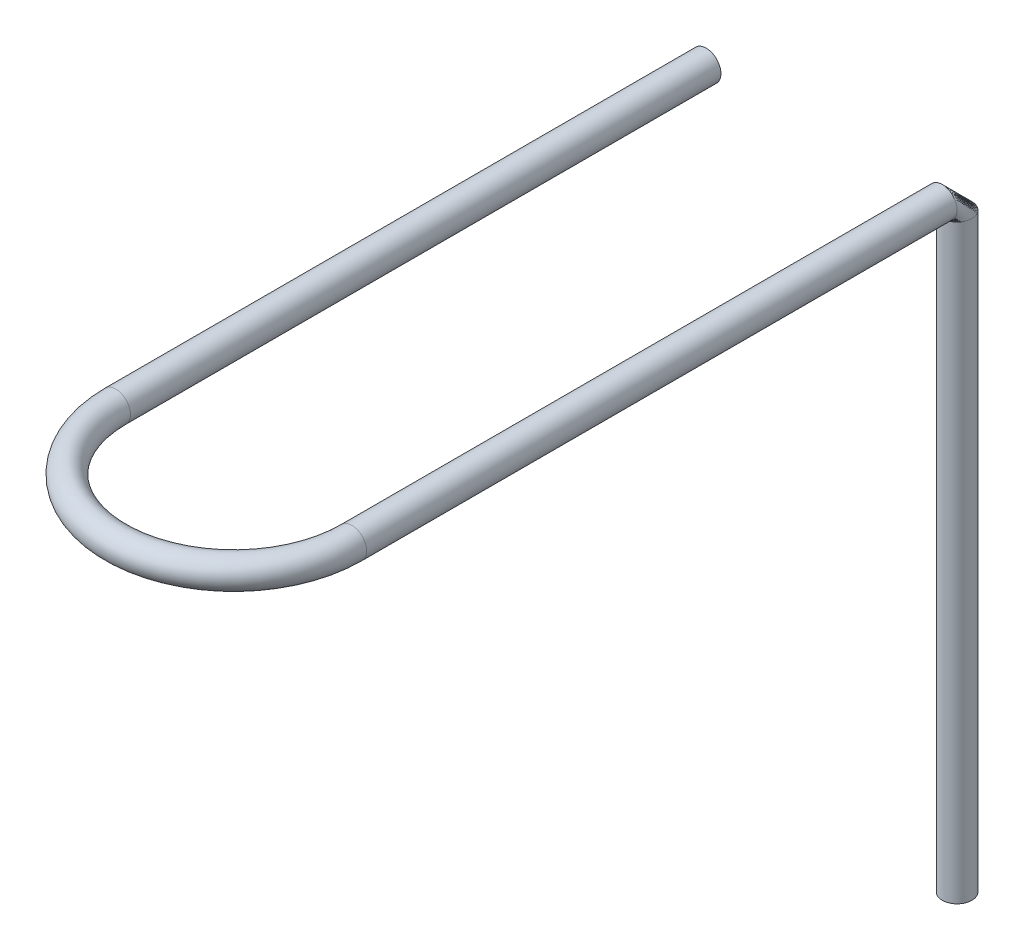
ISO-10303-21;
HEADER;
FILE_DESCRIPTION(('STEP AP214'),'2;1');
FILE_NAME('part.step','',(''),(''),'','','');
FILE_SCHEMA(('AUTOMOTIVE_DESIGN { 1 0 10303 214 1 1 1 1 }'));
ENDSEC;
DATA;
#1=APPLICATION_CONTEXT('core data for automotive mechanical design processes');
#2=APPLICATION_PROTOCOL_DEFINITION('international standard','automotive_design',2000,#1);
#3=PRODUCT_CONTEXT('',#1,'mechanical');
#4=PRODUCT('Part','Part','',(#3));
#5=PRODUCT_RELATED_PRODUCT_CATEGORY('part','',(#4));
#6=PRODUCT_DEFINITION_FORMATION('','',#4);
#7=PRODUCT_DEFINITION_CONTEXT('part definition',#1,'design');
#8=PRODUCT_DEFINITION('design','',#6,#7);
#9=PRODUCT_DEFINITION_SHAPE('','',#8);
#10=(LENGTH_UNIT() NAMED_UNIT(*) SI_UNIT(.MILLI.,.METRE.));
#11=(NAMED_UNIT(*) PLANE_ANGLE_UNIT() SI_UNIT($,.RADIAN.));
#12=(NAMED_UNIT(*) SI_UNIT($,.STERADIAN.) SOLID_ANGLE_UNIT());
#13=UNCERTAINTY_MEASURE_WITH_UNIT(LENGTH_MEASURE(1.E-05),#10,'distance_accuracy_value','');
#14=(GEOMETRIC_REPRESENTATION_CONTEXT(3) GLOBAL_UNCERTAINTY_ASSIGNED_CONTEXT((#13)) GLOBAL_UNIT_ASSIGNED_CONTEXT((#10,
#11,#12)) REPRESENTATION_CONTEXT('',''));
#15=CARTESIAN_POINT('',(0.,0.,0.));
#16=DIRECTION('',(0.,0.,1.));
#17=DIRECTION('',(1.,0.,0.));
#18=AXIS2_PLACEMENT_3D('',#15,#16,#17);
#19=CARTESIAN_POINT('',(-4.,0.,0.));
#20=DIRECTION('',(0.,0.,1.));
#21=DIRECTION('',(1.,0.,0.));
#22=AXIS2_PLACEMENT_3D('',#19,#20,#21);
#23=PLANE('',#22);
#24=CARTESIAN_POINT('',(-4.,0.,0.));
#25=DIRECTION('',(0.,0.,1.));
#26=DIRECTION('',(1.,0.,0.));
#27=AXIS2_PLACEMENT_3D('',#24,#25,#26);
#28=CIRCLE('',#27,0.25);
#29=CARTESIAN_POINT('',(-3.75,0.,0.));
#30=VERTEX_POINT('',#29);
#31=EDGE_CURVE('E12',#30,#30,#28,.T.);
#32=ORIENTED_EDGE('',*,*,#31,.F.);
#33=EDGE_LOOP('',(#32));
#34=FACE_BOUND('',#33,.T.);
#35=ADVANCED_FACE('F57',(#34),#23,.F.);
#36=CARTESIAN_POINT('',(0.,0.,0.));
#37=DIRECTION('',(0.,0.,1.));
#38=DIRECTION('',(1.,0.,0.));
#39=AXIS2_PLACEMENT_3D('',#36,#37,#38);
#40=CYLINDRICAL_SURFACE('',#39,0.25);
#41=CARTESIAN_POINT('',(0.,0.,10.));
#42=DIRECTION('',(0.,0.,-1.));
#43=DIRECTION('',(-1.,0.,0.));
#44=AXIS2_PLACEMENT_3D('',#41,#42,#43);
#45=CIRCLE('',#44,0.25);
#46=CARTESIAN_POINT('',(0.250000000000001,0.,10.));
#47=VERTEX_POINT('',#46);
#48=EDGE_CURVE('E84',#47,#47,#45,.T.);
#49=ORIENTED_EDGE('',*,*,#48,.T.);
#50=EDGE_LOOP('',(#49));
#51=FACE_BOUND('',#50,.T.);
#52=CARTESIAN_POINT('',(0.,0.,0.));
#53=DIRECTION('',(0.,0.,-1.));
#54=DIRECTION('',(-1.,0.,0.));
#55=AXIS2_PLACEMENT_3D('',#52,#53,#54);
#56=CIRCLE('',#55,0.25);
#57=CARTESIAN_POINT('',(0.,-0.25,0.));
#58=VERTEX_POINT('',#57);
#59=EDGE_CURVE('E70',#58,#58,#56,.T.);
#60=ORIENTED_EDGE('',*,*,#59,.F.);
#61=EDGE_LOOP('',(#60));
#62=FACE_BOUND('',#61,.T.);
#63=ADVANCED_FACE('F104',(#51,#62),#40,.T.);
#64=CARTESIAN_POINT('',(-2.,0.,10.));
#65=DIRECTION('',(0.,-1.,0.));
#66=DIRECTION('',(0.,0.,-1.));
#67=AXIS2_PLACEMENT_3D('',#64,#65,#66);
#68=TOROIDAL_SURFACE('',#67,2.,0.25);
#69=CARTESIAN_POINT('',(-4.,0.,10.));
#70=DIRECTION('',(0.,0.,1.));
#71=DIRECTION('',(1.,0.,0.));
#72=AXIS2_PLACEMENT_3D('',#69,#70,#71);
#73=CIRCLE('',#72,0.25);
#74=CARTESIAN_POINT('',(-4.25,0.,10.));
#75=VERTEX_POINT('',#74);
#76=EDGE_CURVE('E64',#75,#75,#73,.T.);
#77=CARTESIAN_POINT('',(-2.,0.,10.));
#78=DIRECTION('',(0.,-1.,0.));
#79=DIRECTION('',(0.,0.,-1.));
#80=AXIS2_PLACEMENT_3D('',#77,#78,#79);
#81=CIRCLE('',#80,2.25);
#82=EDGE_CURVE('',#47,#75,#81,.T.);
#83=ORIENTED_EDGE('',*,*,#48,.F.);
#84=ORIENTED_EDGE('',*,*,#76,.T.);
#85=ORIENTED_EDGE('',*,*,#82,.T.);
#86=ORIENTED_EDGE('',*,*,#82,.F.);
#87=EDGE_LOOP('',(#83,#85,#84,#86));
#88=FACE_BOUND('',#87,.T.);
#89=ADVANCED_FACE('F92',(#88),#68,.T.);
#90=CARTESIAN_POINT('',(-4.,0.,10.));
#91=DIRECTION('',(0.,0.,-1.));
#92=DIRECTION('',(-1.,0.,0.));
#93=AXIS2_PLACEMENT_3D('',#90,#91,#92);
#94=CYLINDRICAL_SURFACE('',#93,0.25);
#95=ORIENTED_EDGE('',*,*,#31,.T.);
#96=EDGE_LOOP('',(#95));
#97=FACE_BOUND('',#96,.T.);
#98=ORIENTED_EDGE('',*,*,#76,.F.);
#99=EDGE_LOOP('',(#98));
#100=FACE_BOUND('',#99,.T.);
#101=ADVANCED_FACE('F95',(#97,#100),#94,.T.);
#102=CARTESIAN_POINT('',(0.,-10.25,-0.250000000000002));
#103=DIRECTION('',(0.,1.,0.));
#104=DIRECTION('',(0.,0.,1.));
#105=AXIS2_PLACEMENT_3D('',#102,#103,#104);
#106=PLANE('',#105);
#107=CARTESIAN_POINT('',(0.,-10.25,-0.250000000000002));
#108=DIRECTION('',(0.,1.,0.));
#109=DIRECTION('',(0.,0.,1.));
#110=AXIS2_PLACEMENT_3D('',#107,#108,#109);
#111=CIRCLE('',#110,0.25);
#112=CARTESIAN_POINT('',(0.,-10.25,0.));
#113=VERTEX_POINT('',#112);
#114=EDGE_CURVE('E78',#113,#113,#111,.T.);
#115=ORIENTED_EDGE('',*,*,#114,.F.);
#116=EDGE_LOOP('',(#115));
#117=FACE_BOUND('',#116,.T.);
#118=ADVANCED_FACE('F97',(#117),#106,.F.);
#119=CARTESIAN_POINT('',(0.,-0.25,0.));
#120=DIRECTION('',(-1.,0.,0.));
#121=DIRECTION('',(0.,0.,1.));
#122=AXIS2_PLACEMENT_3D('',#119,#120,#121);
#123=TOROIDAL_SURFACE('',#122,0.25,0.25);
#124=CARTESIAN_POINT('',(0.,-0.25,-0.25));
#125=DIRECTION('',(0.,1.,0.));
#126=DIRECTION('',(0.,0.,1.));
#127=AXIS2_PLACEMENT_3D('',#124,#125,#126);
#128=CIRCLE('',#127,0.25);
#129=EDGE_CURVE('E82',#58,#58,#128,.T.);
#130=ORIENTED_EDGE('',*,*,#129,.T.);
#131=ORIENTED_EDGE('',*,*,#59,.T.);
#132=EDGE_LOOP('',(#130,#131));
#133=FACE_BOUND('',#132,.T.);
#134=ADVANCED_FACE('F102',(#133),#123,.T.);
#135=CARTESIAN_POINT('',(0.,-0.25,-0.250000000000001));
#136=DIRECTION('',(0.,-1.,0.));
#137=DIRECTION('',(0.,0.,-1.));
#138=AXIS2_PLACEMENT_3D('',#135,#136,#137);
#139=CYLINDRICAL_SURFACE('',#138,0.25);
#140=ORIENTED_EDGE('',*,*,#114,.T.);
#141=EDGE_LOOP('',(#140));
#142=FACE_BOUND('',#141,.T.);
#143=ORIENTED_EDGE('',*,*,#129,.F.);
#144=EDGE_LOOP('',(#143));
#145=FACE_BOUND('',#144,.T.);
#146=ADVANCED_FACE('F79',(#142,#145),#139,.T.);
#147=CLOSED_SHELL('',(#35,#63,#89,#101,#118,#134,#146));
#148=MANIFOLD_SOLID_BREP('B2',#147);
#149=ADVANCED_BREP_SHAPE_REPRESENTATION('',(#18,#148),#14);
#150=SHAPE_DEFINITION_REPRESENTATION(#9,#149);
ENDSEC;
END-ISO-10303-21;
